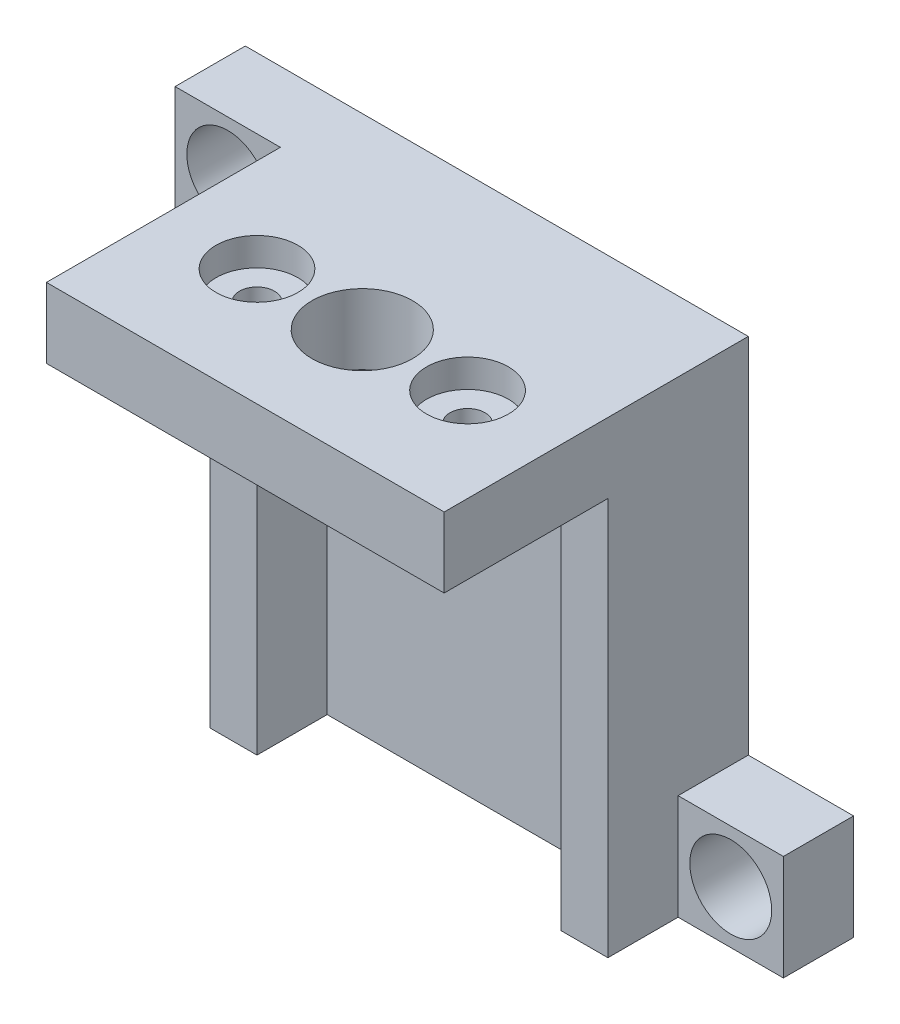
ISO-10303-21;
HEADER;
FILE_DESCRIPTION(('STEP AP214'),'2;1');
FILE_NAME('part.step','',(''),(''),'','','');
FILE_SCHEMA(('AUTOMOTIVE_DESIGN { 1 0 10303 214 1 1 1 1 }'));
ENDSEC;
DATA;
#1=APPLICATION_CONTEXT('core data for automotive mechanical design processes');
#2=APPLICATION_PROTOCOL_DEFINITION('international standard','automotive_design',2000,#1);
#3=PRODUCT_CONTEXT('',#1,'mechanical');
#4=PRODUCT('Part','Part','',(#3));
#5=PRODUCT_RELATED_PRODUCT_CATEGORY('part','',(#4));
#6=PRODUCT_DEFINITION_FORMATION('','',#4);
#7=PRODUCT_DEFINITION_CONTEXT('part definition',#1,'design');
#8=PRODUCT_DEFINITION('design','',#6,#7);
#9=PRODUCT_DEFINITION_SHAPE('','',#8);
#10=(LENGTH_UNIT() NAMED_UNIT(*) SI_UNIT(.MILLI.,.METRE.));
#11=(NAMED_UNIT(*) PLANE_ANGLE_UNIT() SI_UNIT($,.RADIAN.));
#12=(NAMED_UNIT(*) SI_UNIT($,.STERADIAN.) SOLID_ANGLE_UNIT());
#13=UNCERTAINTY_MEASURE_WITH_UNIT(LENGTH_MEASURE(1.E-05),#10,'distance_accuracy_value','');
#14=(GEOMETRIC_REPRESENTATION_CONTEXT(3) GLOBAL_UNCERTAINTY_ASSIGNED_CONTEXT((#13)) GLOBAL_UNIT_ASSIGNED_CONTEXT((#10,
#11,#12)) REPRESENTATION_CONTEXT('',''));
#15=CARTESIAN_POINT('',(0.,0.,0.));
#16=DIRECTION('',(0.,0.,1.));
#17=DIRECTION('',(1.,0.,0.));
#18=AXIS2_PLACEMENT_3D('',#15,#16,#17);
#19=CARTESIAN_POINT('',(0.,0.,6.));
#20=DIRECTION('',(0.,0.,-1.));
#21=DIRECTION('',(-1.,0.,0.));
#22=AXIS2_PLACEMENT_3D('',#19,#20,#21);
#23=PLANE('',#22);
#24=DIRECTION('',(1.,0.,0.));
#25=VECTOR('',#24,1.);
#26=CARTESIAN_POINT('',(0.,17.,6.));
#27=LINE('',#26,#25);
#28=CARTESIAN_POINT('',(0.,17.,6.));
#29=VERTEX_POINT('',#28);
#30=CARTESIAN_POINT('',(2.,17.,6.));
#31=VERTEX_POINT('',#30);
#32=EDGE_CURVE('E11',#29,#31,#27,.T.);
#33=ORIENTED_EDGE('',*,*,#32,.F.);
#34=DIRECTION('',(0.,1.,0.));
#35=VECTOR('',#34,1.);
#36=CARTESIAN_POINT('',(0.,0.,6.));
#37=LINE('',#36,#35);
#38=CARTESIAN_POINT('',(0.,0.,6.));
#39=VERTEX_POINT('',#38);
#40=EDGE_CURVE('E160',#39,#29,#37,.T.);
#41=ORIENTED_EDGE('',*,*,#40,.F.);
#42=DIRECTION('',(-1.,0.,0.));
#43=VECTOR('',#42,1.);
#44=CARTESIAN_POINT('',(2.,0.,6.));
#45=LINE('',#44,#43);
#46=CARTESIAN_POINT('',(2.,0.,6.));
#47=VERTEX_POINT('',#46);
#48=EDGE_CURVE('E192',#47,#39,#45,.T.);
#49=ORIENTED_EDGE('',*,*,#48,.F.);
#50=DIRECTION('',(0.,-1.,0.));
#51=VECTOR('',#50,1.);
#52=CARTESIAN_POINT('',(2.,17.,6.));
#53=LINE('',#52,#51);
#54=EDGE_CURVE('E209',#31,#47,#53,.T.);
#55=ORIENTED_EDGE('',*,*,#54,.F.);
#56=EDGE_LOOP('',(#33,#41,#49,#55));
#57=FACE_BOUND('',#56,.T.);
#58=ADVANCED_FACE('F39',(#57),#23,.F.);
#59=CARTESIAN_POINT('',(15.,17.,6.));
#60=VERTEX_POINT('',#59);
#61=CARTESIAN_POINT('',(17.,17.,6.));
#62=VERTEX_POINT('',#61);
#63=EDGE_CURVE('E49',#60,#62,#27,.T.);
#64=ORIENTED_EDGE('',*,*,#63,.F.);
#65=DIRECTION('',(0.,1.,0.));
#66=VECTOR('',#65,1.);
#67=CARTESIAN_POINT('',(15.,0.,6.));
#68=LINE('',#67,#66);
#69=CARTESIAN_POINT('',(15.,0.,6.));
#70=VERTEX_POINT('',#69);
#71=EDGE_CURVE('E205',#70,#60,#68,.T.);
#72=ORIENTED_EDGE('',*,*,#71,.F.);
#73=DIRECTION('',(-1.,0.,0.));
#74=VECTOR('',#73,1.);
#75=CARTESIAN_POINT('',(17.,0.,6.));
#76=LINE('',#75,#74);
#77=CARTESIAN_POINT('',(17.,0.,6.));
#78=VERTEX_POINT('',#77);
#79=EDGE_CURVE('E201',#78,#70,#76,.T.);
#80=ORIENTED_EDGE('',*,*,#79,.F.);
#81=DIRECTION('',(0.,-1.,0.));
#82=VECTOR('',#81,1.);
#83=CARTESIAN_POINT('',(17.,20.,6.));
#84=LINE('',#83,#82);
#85=EDGE_CURVE('E63',#62,#78,#84,.T.);
#86=ORIENTED_EDGE('',*,*,#85,.F.);
#87=EDGE_LOOP('',(#64,#72,#80,#86));
#88=FACE_BOUND('',#87,.T.);
#89=ADVANCED_FACE('F404',(#88),#23,.F.);
#90=CARTESIAN_POINT('',(0.,0.,3.));
#91=DIRECTION('',(0.,0.,1.));
#92=DIRECTION('',(1.,0.,0.));
#93=AXIS2_PLACEMENT_3D('',#90,#91,#92);
#94=PLANE('',#93);
#95=CARTESIAN_POINT('',(-2.25,17.75,3.));
#96=DIRECTION('',(0.,0.,1.));
#97=DIRECTION('',(1.,0.,0.));
#98=AXIS2_PLACEMENT_3D('',#95,#96,#97);
#99=CIRCLE('',#98,1.75);
#100=CARTESIAN_POINT('',(-0.5,17.75,3.));
#101=VERTEX_POINT('',#100);
#102=EDGE_CURVE('E335',#101,#101,#99,.T.);
#103=ORIENTED_EDGE('',*,*,#102,.F.);
#104=EDGE_LOOP('',(#103));
#105=FACE_BOUND('',#104,.T.);
#106=DIRECTION('',(1.,0.,0.));
#107=VECTOR('',#106,1.);
#108=CARTESIAN_POINT('',(0.,15.5,3.));
#109=LINE('',#108,#107);
#110=CARTESIAN_POINT('',(-4.5,15.5,3.));
#111=VERTEX_POINT('',#110);
#112=CARTESIAN_POINT('',(0.,15.5,3.));
#113=VERTEX_POINT('',#112);
#114=EDGE_CURVE('E268',#111,#113,#109,.T.);
#115=ORIENTED_EDGE('',*,*,#114,.T.);
#116=DIRECTION('',(0.,1.,0.));
#117=VECTOR('',#116,1.);
#118=CARTESIAN_POINT('',(0.,15.5,3.));
#119=LINE('',#118,#117);
#120=CARTESIAN_POINT('',(0.,20.,3.));
#121=VERTEX_POINT('',#120);
#122=EDGE_CURVE('E214',#113,#121,#119,.T.);
#123=ORIENTED_EDGE('',*,*,#122,.T.);
#124=DIRECTION('',(-1.,0.,0.));
#125=VECTOR('',#124,1.);
#126=CARTESIAN_POINT('',(0.,20.,3.));
#127=LINE('',#126,#125);
#128=CARTESIAN_POINT('',(-4.5,20.,3.));
#129=VERTEX_POINT('',#128);
#130=EDGE_CURVE('E262',#121,#129,#127,.T.);
#131=ORIENTED_EDGE('',*,*,#130,.T.);
#132=DIRECTION('',(0.,-1.,0.));
#133=VECTOR('',#132,1.);
#134=CARTESIAN_POINT('',(-4.5,20.,3.));
#135=LINE('',#134,#133);
#136=EDGE_CURVE('E265',#129,#111,#135,.T.);
#137=ORIENTED_EDGE('',*,*,#136,.T.);
#138=EDGE_LOOP('',(#115,#123,#131,#137));
#139=FACE_BOUND('',#138,.T.);
#140=ADVANCED_FACE('F409',(#105,#139),#94,.T.);
#141=CARTESIAN_POINT('',(19.25,2.25,3.));
#142=DIRECTION('',(0.,0.,1.));
#143=DIRECTION('',(1.,0.,0.));
#144=AXIS2_PLACEMENT_3D('',#141,#142,#143);
#145=CIRCLE('',#144,1.75);
#146=CARTESIAN_POINT('',(21.,2.25,3.));
#147=VERTEX_POINT('',#146);
#148=EDGE_CURVE('E353',#147,#147,#145,.T.);
#149=ORIENTED_EDGE('',*,*,#148,.F.);
#150=EDGE_LOOP('',(#149));
#151=FACE_BOUND('',#150,.T.);
#152=DIRECTION('',(-1.,0.,0.));
#153=VECTOR('',#152,1.);
#154=CARTESIAN_POINT('',(17.,4.5,3.));
#155=LINE('',#154,#153);
#156=CARTESIAN_POINT('',(21.5,4.5,3.));
#157=VERTEX_POINT('',#156);
#158=CARTESIAN_POINT('',(17.,4.5,3.));
#159=VERTEX_POINT('',#158);
#160=EDGE_CURVE('E258',#157,#159,#155,.T.);
#161=ORIENTED_EDGE('',*,*,#160,.T.);
#162=DIRECTION('',(0.,-1.,0.));
#163=VECTOR('',#162,1.);
#164=CARTESIAN_POINT('',(17.,20.,3.));
#165=LINE('',#164,#163);
#166=CARTESIAN_POINT('',(17.,0.,3.));
#167=VERTEX_POINT('',#166);
#168=EDGE_CURVE('E217',#159,#167,#165,.T.);
#169=ORIENTED_EDGE('',*,*,#168,.T.);
#170=DIRECTION('',(1.,0.,0.));
#171=VECTOR('',#170,1.);
#172=CARTESIAN_POINT('',(0.,0.,3.));
#173=LINE('',#172,#171);
#174=CARTESIAN_POINT('',(21.5,0.,3.));
#175=VERTEX_POINT('',#174);
#176=EDGE_CURVE('E250',#167,#175,#173,.T.);
#177=ORIENTED_EDGE('',*,*,#176,.T.);
#178=DIRECTION('',(0.,1.,0.));
#179=VECTOR('',#178,1.);
#180=CARTESIAN_POINT('',(21.5,0.,3.));
#181=LINE('',#180,#179);
#182=EDGE_CURVE('E255',#175,#157,#181,.T.);
#183=ORIENTED_EDGE('',*,*,#182,.T.);
#184=EDGE_LOOP('',(#161,#169,#177,#183));
#185=FACE_BOUND('',#184,.T.);
#186=ADVANCED_FACE('F427',(#151,#185),#94,.T.);
#187=CARTESIAN_POINT('',(2.,0.,3.));
#188=VERTEX_POINT('',#187);
#189=CARTESIAN_POINT('',(15.,0.,3.));
#190=VERTEX_POINT('',#189);
#191=EDGE_CURVE('E253',#188,#190,#173,.T.);
#192=ORIENTED_EDGE('',*,*,#191,.T.);
#193=DIRECTION('',(0.,1.,0.));
#194=VECTOR('',#193,1.);
#195=CARTESIAN_POINT('',(15.,0.,3.));
#196=LINE('',#195,#194);
#197=CARTESIAN_POINT('',(15.,17.,3.));
#198=VERTEX_POINT('',#197);
#199=EDGE_CURVE('E190',#190,#198,#196,.T.);
#200=ORIENTED_EDGE('',*,*,#199,.T.);
#201=DIRECTION('',(-1.,0.,0.));
#202=VECTOR('',#201,1.);
#203=CARTESIAN_POINT('',(15.,17.,3.));
#204=LINE('',#203,#202);
#205=CARTESIAN_POINT('',(2.,17.,3.));
#206=VERTEX_POINT('',#205);
#207=EDGE_CURVE('E225',#198,#206,#204,.T.);
#208=ORIENTED_EDGE('',*,*,#207,.T.);
#209=DIRECTION('',(0.,-1.,0.));
#210=VECTOR('',#209,1.);
#211=CARTESIAN_POINT('',(2.,17.,3.));
#212=LINE('',#211,#210);
#213=EDGE_CURVE('E196',#206,#188,#212,.T.);
#214=ORIENTED_EDGE('',*,*,#213,.T.);
#215=EDGE_LOOP('',(#192,#200,#208,#214));
#216=FACE_BOUND('',#215,.T.);
#217=ADVANCED_FACE('F429',(#216),#94,.T.);
#218=CARTESIAN_POINT('',(0.,0.,3.));
#219=DIRECTION('',(1.,0.,0.));
#220=DIRECTION('',(0.,1.,0.));
#221=AXIS2_PLACEMENT_3D('',#218,#219,#220);
#222=PLANE('',#221);
#223=DIRECTION('',(0.,0.,-1.));
#224=VECTOR('',#223,1.);
#225=CARTESIAN_POINT('',(0.,20.,6.));
#226=LINE('',#225,#224);
#227=CARTESIAN_POINT('',(0.,20.,13.));
#228=VERTEX_POINT('',#227);
#229=EDGE_CURVE('E213',#228,#121,#226,.T.);
#230=ORIENTED_EDGE('',*,*,#229,.T.);
#231=ORIENTED_EDGE('',*,*,#122,.F.);
#232=DIRECTION('',(0.,0.,-1.));
#233=VECTOR('',#232,1.);
#234=CARTESIAN_POINT('',(0.,15.5,3.));
#235=LINE('',#234,#233);
#236=CARTESIAN_POINT('',(0.,15.5,0.));
#237=VERTEX_POINT('',#236);
#238=EDGE_CURVE('E272',#113,#237,#235,.T.);
#239=ORIENTED_EDGE('',*,*,#238,.T.);
#240=DIRECTION('',(0.,-1.,0.));
#241=VECTOR('',#240,1.);
#242=CARTESIAN_POINT('',(0.,0.,0.));
#243=LINE('',#242,#241);
#244=CARTESIAN_POINT('',(0.,0.,0.));
#245=VERTEX_POINT('',#244);
#246=EDGE_CURVE('E235',#237,#245,#243,.T.);
#247=ORIENTED_EDGE('',*,*,#246,.T.);
#248=DIRECTION('',(0.,0.,-1.));
#249=VECTOR('',#248,1.);
#250=CARTESIAN_POINT('',(0.,0.,3.));
#251=LINE('',#250,#249);
#252=EDGE_CURVE('E221',#39,#245,#251,.T.);
#253=ORIENTED_EDGE('',*,*,#252,.F.);
#254=ORIENTED_EDGE('',*,*,#40,.T.);
#255=DIRECTION('',(0.,0.,1.));
#256=VECTOR('',#255,1.);
#257=CARTESIAN_POINT('',(0.,17.,0.));
#258=LINE('',#257,#256);
#259=CARTESIAN_POINT('',(0.,17.,13.));
#260=VERTEX_POINT('',#259);
#261=EDGE_CURVE('E155',#29,#260,#258,.T.);
#262=ORIENTED_EDGE('',*,*,#261,.T.);
#263=DIRECTION('',(0.,1.,0.));
#264=VECTOR('',#263,1.);
#265=CARTESIAN_POINT('',(0.,17.,13.));
#266=LINE('',#265,#264);
#267=EDGE_CURVE('E158',#260,#228,#266,.T.);
#268=ORIENTED_EDGE('',*,*,#267,.T.);
#269=EDGE_LOOP('',(#230,#231,#239,#247,#253,#254,#262,#268));
#270=FACE_BOUND('',#269,.T.);
#271=ADVANCED_FACE('F41',(#270),#222,.F.);
#272=CARTESIAN_POINT('',(17.,0.,3.));
#273=DIRECTION('',(0.,1.,0.));
#274=DIRECTION('',(0.,0.,1.));
#275=AXIS2_PLACEMENT_3D('',#272,#273,#274);
#276=PLANE('',#275);
#277=DIRECTION('',(1.,0.,0.));
#278=VECTOR('',#277,1.);
#279=CARTESIAN_POINT('',(17.,0.,0.));
#280=LINE('',#279,#278);
#281=CARTESIAN_POINT('',(21.5,0.,0.));
#282=VERTEX_POINT('',#281);
#283=EDGE_CURVE('E276',#245,#282,#280,.T.);
#284=ORIENTED_EDGE('',*,*,#283,.T.);
#285=DIRECTION('',(0.,0.,-1.));
#286=VECTOR('',#285,1.);
#287=CARTESIAN_POINT('',(21.5,0.,3.));
#288=LINE('',#287,#286);
#289=EDGE_CURVE('E319',#175,#282,#288,.T.);
#290=ORIENTED_EDGE('',*,*,#289,.F.);
#291=ORIENTED_EDGE('',*,*,#176,.F.);
#292=DIRECTION('',(0.,0.,-1.));
#293=VECTOR('',#292,1.);
#294=CARTESIAN_POINT('',(17.,0.,6.));
#295=LINE('',#294,#293);
#296=EDGE_CURVE('E245',#78,#167,#295,.T.);
#297=ORIENTED_EDGE('',*,*,#296,.F.);
#298=ORIENTED_EDGE('',*,*,#79,.T.);
#299=DIRECTION('',(0.,0.,-1.));
#300=VECTOR('',#299,1.);
#301=CARTESIAN_POINT('',(15.,0.,6.));
#302=LINE('',#301,#300);
#303=EDGE_CURVE('E242',#70,#190,#302,.T.);
#304=ORIENTED_EDGE('',*,*,#303,.T.);
#305=ORIENTED_EDGE('',*,*,#191,.F.);
#306=DIRECTION('',(0.,0.,-1.));
#307=VECTOR('',#306,1.);
#308=CARTESIAN_POINT('',(2.,0.,6.));
#309=LINE('',#308,#307);
#310=EDGE_CURVE('E232',#47,#188,#309,.T.);
#311=ORIENTED_EDGE('',*,*,#310,.F.);
#312=ORIENTED_EDGE('',*,*,#48,.T.);
#313=ORIENTED_EDGE('',*,*,#252,.T.);
#314=EDGE_LOOP('',(#284,#290,#291,#297,#298,#304,#305,#311,#312,#313));
#315=FACE_BOUND('',#314,.T.);
#316=ADVANCED_FACE('F448',(#315),#276,.F.);
#317=CARTESIAN_POINT('',(21.5,0.,3.));
#318=DIRECTION('',(-1.,0.,0.));
#319=DIRECTION('',(0.,-1.,0.));
#320=AXIS2_PLACEMENT_3D('',#317,#318,#319);
#321=PLANE('',#320);
#322=DIRECTION('',(0.,1.,0.));
#323=VECTOR('',#322,1.);
#324=CARTESIAN_POINT('',(21.5,0.,0.));
#325=LINE('',#324,#323);
#326=CARTESIAN_POINT('',(21.5,4.5,0.));
#327=VERTEX_POINT('',#326);
#328=EDGE_CURVE('E279',#282,#327,#325,.T.);
#329=ORIENTED_EDGE('',*,*,#328,.T.);
#330=DIRECTION('',(0.,0.,-1.));
#331=VECTOR('',#330,1.);
#332=CARTESIAN_POINT('',(21.5,4.5,3.));
#333=LINE('',#332,#331);
#334=EDGE_CURVE('E315',#157,#327,#333,.T.);
#335=ORIENTED_EDGE('',*,*,#334,.F.);
#336=ORIENTED_EDGE('',*,*,#182,.F.);
#337=ORIENTED_EDGE('',*,*,#289,.T.);
#338=EDGE_LOOP('',(#329,#335,#336,#337));
#339=FACE_BOUND('',#338,.T.);
#340=ADVANCED_FACE('F474',(#339),#321,.F.);
#341=CARTESIAN_POINT('',(17.,4.5,3.));
#342=DIRECTION('',(0.,-1.,0.));
#343=DIRECTION('',(0.,0.,-1.));
#344=AXIS2_PLACEMENT_3D('',#341,#342,#343);
#345=PLANE('',#344);
#346=DIRECTION('',(-1.,0.,0.));
#347=VECTOR('',#346,1.);
#348=CARTESIAN_POINT('',(17.,4.5,0.));
#349=LINE('',#348,#347);
#350=CARTESIAN_POINT('',(17.,4.5,0.));
#351=VERTEX_POINT('',#350);
#352=EDGE_CURVE('E282',#327,#351,#349,.T.);
#353=ORIENTED_EDGE('',*,*,#352,.T.);
#354=DIRECTION('',(0.,0.,-1.));
#355=VECTOR('',#354,1.);
#356=CARTESIAN_POINT('',(17.,4.5,3.));
#357=LINE('',#356,#355);
#358=EDGE_CURVE('E311',#159,#351,#357,.T.);
#359=ORIENTED_EDGE('',*,*,#358,.F.);
#360=ORIENTED_EDGE('',*,*,#160,.F.);
#361=ORIENTED_EDGE('',*,*,#334,.T.);
#362=EDGE_LOOP('',(#353,#359,#360,#361));
#363=FACE_BOUND('',#362,.T.);
#364=ADVANCED_FACE('F399',(#363),#345,.F.);
#365=CARTESIAN_POINT('',(17.,4.5,3.));
#366=DIRECTION('',(-1.,0.,0.));
#367=DIRECTION('',(0.,-1.,0.));
#368=AXIS2_PLACEMENT_3D('',#365,#366,#367);
#369=PLANE('',#368);
#370=DIRECTION('',(0.,0.,-1.));
#371=VECTOR('',#370,1.);
#372=CARTESIAN_POINT('',(17.,20.,3.));
#373=LINE('',#372,#371);
#374=CARTESIAN_POINT('',(17.,20.,13.));
#375=VERTEX_POINT('',#374);
#376=CARTESIAN_POINT('',(17.,20.,0.));
#377=VERTEX_POINT('',#376);
#378=EDGE_CURVE('E307',#375,#377,#373,.T.);
#379=ORIENTED_EDGE('',*,*,#378,.F.);
#380=DIRECTION('',(0.,1.,0.));
#381=VECTOR('',#380,1.);
#382=CARTESIAN_POINT('',(17.,17.,13.));
#383=LINE('',#382,#381);
#384=CARTESIAN_POINT('',(17.,17.,13.));
#385=VERTEX_POINT('',#384);
#386=EDGE_CURVE('E173',#385,#375,#383,.T.);
#387=ORIENTED_EDGE('',*,*,#386,.F.);
#388=DIRECTION('',(0.,0.,-1.));
#389=VECTOR('',#388,1.);
#390=CARTESIAN_POINT('',(17.,17.,0.));
#391=LINE('',#390,#389);
#392=EDGE_CURVE('E174',#385,#62,#391,.T.);
#393=ORIENTED_EDGE('',*,*,#392,.T.);
#394=ORIENTED_EDGE('',*,*,#85,.T.);
#395=ORIENTED_EDGE('',*,*,#296,.T.);
#396=ORIENTED_EDGE('',*,*,#168,.F.);
#397=ORIENTED_EDGE('',*,*,#358,.T.);
#398=DIRECTION('',(0.,1.,0.));
#399=VECTOR('',#398,1.);
#400=CARTESIAN_POINT('',(17.,4.5,0.));
#401=LINE('',#400,#399);
#402=EDGE_CURVE('E285',#351,#377,#401,.T.);
#403=ORIENTED_EDGE('',*,*,#402,.T.);
#404=EDGE_LOOP('',(#379,#387,#393,#394,#395,#396,#397,#403));
#405=FACE_BOUND('',#404,.T.);
#406=ADVANCED_FACE('F389',(#405),#369,.F.);
#407=CARTESIAN_POINT('',(0.,20.,3.));
#408=DIRECTION('',(0.,-1.,0.));
#409=DIRECTION('',(0.,0.,-1.));
#410=AXIS2_PLACEMENT_3D('',#407,#408,#409);
#411=PLANE('',#410);
#412=CARTESIAN_POINT('',(4.,20.,8.));
#413=DIRECTION('',(0.,-1.,0.));
#414=DIRECTION('',(0.,0.,-1.));
#415=AXIS2_PLACEMENT_3D('',#412,#413,#414);
#416=CIRCLE('',#415,1.75);
#417=CARTESIAN_POINT('',(4.,20.,6.25));
#418=VERTEX_POINT('',#417);
#419=EDGE_CURVE('E337',#418,#418,#416,.T.);
#420=ORIENTED_EDGE('',*,*,#419,.T.);
#421=EDGE_LOOP('',(#420));
#422=FACE_BOUND('',#421,.T.);
#423=CARTESIAN_POINT('',(13.,20.,8.));
#424=DIRECTION('',(0.,-1.,0.));
#425=DIRECTION('',(0.,0.,-1.));
#426=AXIS2_PLACEMENT_3D('',#423,#424,#425);
#427=CIRCLE('',#426,1.75);
#428=CARTESIAN_POINT('',(13.,20.,6.25));
#429=VERTEX_POINT('',#428);
#430=EDGE_CURVE('E349',#429,#429,#427,.T.);
#431=ORIENTED_EDGE('',*,*,#430,.T.);
#432=EDGE_LOOP('',(#431));
#433=FACE_BOUND('',#432,.T.);
#434=ORIENTED_EDGE('',*,*,#130,.F.);
#435=ORIENTED_EDGE('',*,*,#229,.F.);
#436=DIRECTION('',(1.,0.,0.));
#437=VECTOR('',#436,1.);
#438=CARTESIAN_POINT('',(0.,20.,13.));
#439=LINE('',#438,#437);
#440=EDGE_CURVE('E165',#228,#375,#439,.T.);
#441=ORIENTED_EDGE('',*,*,#440,.T.);
#442=ORIENTED_EDGE('',*,*,#378,.T.);
#443=DIRECTION('',(-1.,0.,0.));
#444=VECTOR('',#443,1.);
#445=CARTESIAN_POINT('',(0.,20.,0.));
#446=LINE('',#445,#444);
#447=CARTESIAN_POINT('',(-4.5,20.,0.));
#448=VERTEX_POINT('',#447);
#449=EDGE_CURVE('E288',#377,#448,#446,.T.);
#450=ORIENTED_EDGE('',*,*,#449,.T.);
#451=DIRECTION('',(0.,0.,-1.));
#452=VECTOR('',#451,1.);
#453=CARTESIAN_POINT('',(-4.5,20.,3.));
#454=LINE('',#453,#452);
#455=EDGE_CURVE('E303',#129,#448,#454,.T.);
#456=ORIENTED_EDGE('',*,*,#455,.F.);
#457=EDGE_LOOP('',(#434,#435,#441,#442,#450,#456));
#458=FACE_BOUND('',#457,.T.);
#459=CARTESIAN_POINT('',(8.5,20.,8.));
#460=DIRECTION('',(0.,1.,0.));
#461=DIRECTION('',(0.,0.,1.));
#462=AXIS2_PLACEMENT_3D('',#459,#460,#461);
#463=CIRCLE('',#462,2.15);
#464=CARTESIAN_POINT('',(8.5,20.,10.15));
#465=VERTEX_POINT('',#464);
#466=EDGE_CURVE('E376',#465,#465,#463,.T.);
#467=ORIENTED_EDGE('',*,*,#466,.F.);
#468=EDGE_LOOP('',(#467));
#469=FACE_BOUND('',#468,.T.);
#470=ADVANCED_FACE('F386',(#422,#433,#458,#469),#411,.F.);
#471=CARTESIAN_POINT('',(-4.5,20.,3.));
#472=DIRECTION('',(1.,0.,0.));
#473=DIRECTION('',(0.,0.,-1.));
#474=AXIS2_PLACEMENT_3D('',#471,#472,#473);
#475=PLANE('',#474);
#476=DIRECTION('',(0.,-1.,0.));
#477=VECTOR('',#476,1.);
#478=CARTESIAN_POINT('',(-4.5,20.,0.));
#479=LINE('',#478,#477);
#480=CARTESIAN_POINT('',(-4.5,15.5,0.));
#481=VERTEX_POINT('',#480);
#482=EDGE_CURVE('E291',#448,#481,#479,.T.);
#483=ORIENTED_EDGE('',*,*,#482,.T.);
#484=DIRECTION('',(0.,0.,-1.));
#485=VECTOR('',#484,1.);
#486=CARTESIAN_POINT('',(-4.5,15.5,3.));
#487=LINE('',#486,#485);
#488=EDGE_CURVE('E299',#111,#481,#487,.T.);
#489=ORIENTED_EDGE('',*,*,#488,.F.);
#490=ORIENTED_EDGE('',*,*,#136,.F.);
#491=ORIENTED_EDGE('',*,*,#455,.T.);
#492=EDGE_LOOP('',(#483,#489,#490,#491));
#493=FACE_BOUND('',#492,.T.);
#494=ADVANCED_FACE('F388',(#493),#475,.F.);
#495=CARTESIAN_POINT('',(0.,15.5,3.));
#496=DIRECTION('',(0.,1.,0.));
#497=DIRECTION('',(0.,0.,1.));
#498=AXIS2_PLACEMENT_3D('',#495,#496,#497);
#499=PLANE('',#498);
#500=DIRECTION('',(1.,0.,0.));
#501=VECTOR('',#500,1.);
#502=CARTESIAN_POINT('',(0.,15.5,0.));
#503=LINE('',#502,#501);
#504=EDGE_CURVE('E254',#481,#237,#503,.T.);
#505=ORIENTED_EDGE('',*,*,#504,.T.);
#506=ORIENTED_EDGE('',*,*,#238,.F.);
#507=ORIENTED_EDGE('',*,*,#114,.F.);
#508=ORIENTED_EDGE('',*,*,#488,.T.);
#509=EDGE_LOOP('',(#505,#506,#507,#508));
#510=FACE_BOUND('',#509,.T.);
#511=ADVANCED_FACE('F396',(#510),#499,.F.);
#512=CARTESIAN_POINT('',(0.,0.,0.));
#513=DIRECTION('',(0.,0.,1.));
#514=DIRECTION('',(1.,0.,0.));
#515=AXIS2_PLACEMENT_3D('',#512,#513,#514);
#516=PLANE('',#515);
#517=CARTESIAN_POINT('',(19.25,2.25,0.));
#518=DIRECTION('',(0.,0.,1.));
#519=DIRECTION('',(1.,0.,0.));
#520=AXIS2_PLACEMENT_3D('',#517,#518,#519);
#521=CIRCLE('',#520,1.75);
#522=CARTESIAN_POINT('',(21.,2.25,0.));
#523=VERTEX_POINT('',#522);
#524=EDGE_CURVE('E357',#523,#523,#521,.F.);
#525=ORIENTED_EDGE('',*,*,#524,.F.);
#526=EDGE_LOOP('',(#525));
#527=FACE_BOUND('',#526,.T.);
#528=CARTESIAN_POINT('',(-2.25,17.75,0.));
#529=DIRECTION('',(0.,0.,1.));
#530=DIRECTION('',(1.,0.,0.));
#531=AXIS2_PLACEMENT_3D('',#528,#529,#530);
#532=CIRCLE('',#531,1.75);
#533=CARTESIAN_POINT('',(-0.5,17.75,0.));
#534=VERTEX_POINT('',#533);
#535=EDGE_CURVE('E358',#534,#534,#532,.F.);
#536=ORIENTED_EDGE('',*,*,#535,.F.);
#537=EDGE_LOOP('',(#536));
#538=FACE_BOUND('',#537,.T.);
#539=ORIENTED_EDGE('',*,*,#482,.F.);
#540=ORIENTED_EDGE('',*,*,#449,.F.);
#541=ORIENTED_EDGE('',*,*,#402,.F.);
#542=ORIENTED_EDGE('',*,*,#352,.F.);
#543=ORIENTED_EDGE('',*,*,#328,.F.);
#544=ORIENTED_EDGE('',*,*,#283,.F.);
#545=ORIENTED_EDGE('',*,*,#246,.F.);
#546=ORIENTED_EDGE('',*,*,#504,.F.);
#547=EDGE_LOOP('',(#539,#540,#541,#542,#543,#544,#545,#546));
#548=FACE_BOUND('',#547,.T.);
#549=ADVANCED_FACE('F416',(#527,#538,#548),#516,.F.);
#550=CARTESIAN_POINT('',(2.,17.,6.));
#551=DIRECTION('',(1.,0.,0.));
#552=DIRECTION('',(0.,1.,0.));
#553=AXIS2_PLACEMENT_3D('',#550,#551,#552);
#554=PLANE('',#553);
#555=ORIENTED_EDGE('',*,*,#213,.F.);
#556=DIRECTION('',(0.,0.,-1.));
#557=VECTOR('',#556,1.);
#558=CARTESIAN_POINT('',(2.,17.,6.));
#559=LINE('',#558,#557);
#560=EDGE_CURVE('E236',#31,#206,#559,.T.);
#561=ORIENTED_EDGE('',*,*,#560,.F.);
#562=ORIENTED_EDGE('',*,*,#54,.T.);
#563=ORIENTED_EDGE('',*,*,#310,.T.);
#564=EDGE_LOOP('',(#555,#561,#562,#563));
#565=FACE_BOUND('',#564,.T.);
#566=ADVANCED_FACE('F413',(#565),#554,.T.);
#567=CARTESIAN_POINT('',(15.,17.,6.));
#568=DIRECTION('',(0.,-1.,0.));
#569=DIRECTION('',(0.,0.,-1.));
#570=AXIS2_PLACEMENT_3D('',#567,#568,#569);
#571=PLANE('',#570);
#572=CARTESIAN_POINT('',(8.5,17.,8.));
#573=DIRECTION('',(0.,1.,0.));
#574=DIRECTION('',(0.,0.,1.));
#575=AXIS2_PLACEMENT_3D('',#572,#573,#574);
#576=CIRCLE('',#575,2.15);
#577=CARTESIAN_POINT('',(8.5,17.,10.15));
#578=VERTEX_POINT('',#577);
#579=EDGE_CURVE('E188',#578,#578,#576,.T.);
#580=ORIENTED_EDGE('',*,*,#579,.T.);
#581=EDGE_LOOP('',(#580));
#582=FACE_BOUND('',#581,.T.);
#583=ORIENTED_EDGE('',*,*,#32,.T.);
#584=ORIENTED_EDGE('',*,*,#560,.T.);
#585=ORIENTED_EDGE('',*,*,#207,.F.);
#586=DIRECTION('',(0.,0.,-1.));
#587=VECTOR('',#586,1.);
#588=CARTESIAN_POINT('',(15.,17.,6.));
#589=LINE('',#588,#587);
#590=EDGE_CURVE('E239',#60,#198,#589,.T.);
#591=ORIENTED_EDGE('',*,*,#590,.F.);
#592=ORIENTED_EDGE('',*,*,#63,.T.);
#593=ORIENTED_EDGE('',*,*,#392,.F.);
#594=DIRECTION('',(1.,0.,0.));
#595=VECTOR('',#594,1.);
#596=CARTESIAN_POINT('',(0.,17.,13.));
#597=LINE('',#596,#595);
#598=EDGE_CURVE('E164',#260,#385,#597,.T.);
#599=ORIENTED_EDGE('',*,*,#598,.F.);
#600=ORIENTED_EDGE('',*,*,#261,.F.);
#601=EDGE_LOOP('',(#583,#584,#585,#591,#592,#593,#599,#600));
#602=FACE_BOUND('',#601,.T.);
#603=CARTESIAN_POINT('',(4.,17.,8.));
#604=DIRECTION('',(0.,1.,0.));
#605=DIRECTION('',(0.,0.,1.));
#606=AXIS2_PLACEMENT_3D('',#603,#604,#605);
#607=CIRCLE('',#606,0.749999999999999);
#608=CARTESIAN_POINT('',(4.,17.,8.75));
#609=VERTEX_POINT('',#608);
#610=EDGE_CURVE('E362',#609,#609,#607,.T.);
#611=ORIENTED_EDGE('',*,*,#610,.T.);
#612=EDGE_LOOP('',(#611));
#613=FACE_BOUND('',#612,.T.);
#614=CARTESIAN_POINT('',(13.,17.,8.));
#615=DIRECTION('',(0.,1.,0.));
#616=DIRECTION('',(0.,0.,1.));
#617=AXIS2_PLACEMENT_3D('',#614,#615,#616);
#618=CIRCLE('',#617,0.75);
#619=CARTESIAN_POINT('',(13.,17.,8.75));
#620=VERTEX_POINT('',#619);
#621=EDGE_CURVE('E372',#620,#620,#618,.T.);
#622=ORIENTED_EDGE('',*,*,#621,.T.);
#623=EDGE_LOOP('',(#622));
#624=FACE_BOUND('',#623,.T.);
#625=ADVANCED_FACE('F177',(#582,#602,#613,#624),#571,.T.);
#626=CARTESIAN_POINT('',(15.,0.,6.));
#627=DIRECTION('',(-1.,0.,0.));
#628=DIRECTION('',(0.,0.,1.));
#629=AXIS2_PLACEMENT_3D('',#626,#627,#628);
#630=PLANE('',#629);
#631=ORIENTED_EDGE('',*,*,#199,.F.);
#632=ORIENTED_EDGE('',*,*,#303,.F.);
#633=ORIENTED_EDGE('',*,*,#71,.T.);
#634=ORIENTED_EDGE('',*,*,#590,.T.);
#635=EDGE_LOOP('',(#631,#632,#633,#634));
#636=FACE_BOUND('',#635,.T.);
#637=ADVANCED_FACE('F420',(#636),#630,.T.);
#638=CARTESIAN_POINT('',(8.5,17.,8.));
#639=DIRECTION('',(0.,1.,0.));
#640=DIRECTION('',(0.,0.,1.));
#641=AXIS2_PLACEMENT_3D('',#638,#639,#640);
#642=CYLINDRICAL_SURFACE('',#641,2.15);
#643=ORIENTED_EDGE('',*,*,#466,.T.);
#644=EDGE_LOOP('',(#643));
#645=FACE_BOUND('',#644,.T.);
#646=ORIENTED_EDGE('',*,*,#579,.F.);
#647=EDGE_LOOP('',(#646));
#648=FACE_BOUND('',#647,.T.);
#649=ADVANCED_FACE('F383',(#645,#648),#642,.F.);
#650=CARTESIAN_POINT('',(0.,17.,13.));
#651=DIRECTION('',(0.,0.,1.));
#652=DIRECTION('',(1.,0.,0.));
#653=AXIS2_PLACEMENT_3D('',#650,#651,#652);
#654=PLANE('',#653);
#655=ORIENTED_EDGE('',*,*,#440,.F.);
#656=ORIENTED_EDGE('',*,*,#267,.F.);
#657=ORIENTED_EDGE('',*,*,#598,.T.);
#658=ORIENTED_EDGE('',*,*,#386,.T.);
#659=EDGE_LOOP('',(#655,#656,#657,#658));
#660=FACE_BOUND('',#659,.T.);
#661=ADVANCED_FACE('F169',(#660),#654,.T.);
#662=CARTESIAN_POINT('',(13.,17.,8.));
#663=DIRECTION('',(0.,1.,0.));
#664=DIRECTION('',(0.,0.,1.));
#665=AXIS2_PLACEMENT_3D('',#662,#663,#664);
#666=CYLINDRICAL_SURFACE('',#665,0.75);
#667=CARTESIAN_POINT('',(13.,18.8,8.));
#668=DIRECTION('',(0.,-1.,0.));
#669=DIRECTION('',(0.,0.,-1.));
#670=AXIS2_PLACEMENT_3D('',#667,#668,#669);
#671=CIRCLE('',#670,0.75);
#672=CARTESIAN_POINT('',(13.,18.8,7.25));
#673=VERTEX_POINT('',#672);
#674=EDGE_CURVE('E43',#673,#673,#671,.F.);
#675=ORIENTED_EDGE('',*,*,#674,.T.);
#676=EDGE_LOOP('',(#675));
#677=FACE_BOUND('',#676,.T.);
#678=ORIENTED_EDGE('',*,*,#621,.F.);
#679=EDGE_LOOP('',(#678));
#680=FACE_BOUND('',#679,.T.);
#681=ADVANCED_FACE('F513',(#677,#680),#666,.F.);
#682=CARTESIAN_POINT('',(4.,17.,8.));
#683=DIRECTION('',(0.,1.,0.));
#684=DIRECTION('',(0.,0.,1.));
#685=AXIS2_PLACEMENT_3D('',#682,#683,#684);
#686=CYLINDRICAL_SURFACE('',#685,0.749999999999999);
#687=CARTESIAN_POINT('',(4.,18.8,8.));
#688=DIRECTION('',(0.,-1.,0.));
#689=DIRECTION('',(0.,0.,-1.));
#690=AXIS2_PLACEMENT_3D('',#687,#688,#689);
#691=CIRCLE('',#690,0.749999999999999);
#692=CARTESIAN_POINT('',(4.,18.8,7.25));
#693=VERTEX_POINT('',#692);
#694=EDGE_CURVE('E326',#693,#693,#691,.F.);
#695=ORIENTED_EDGE('',*,*,#694,.T.);
#696=EDGE_LOOP('',(#695));
#697=FACE_BOUND('',#696,.T.);
#698=ORIENTED_EDGE('',*,*,#610,.F.);
#699=EDGE_LOOP('',(#698));
#700=FACE_BOUND('',#699,.T.);
#701=ADVANCED_FACE('F507',(#697,#700),#686,.F.);
#702=CARTESIAN_POINT('',(-2.25,17.75,-0.00100000000000013));
#703=DIRECTION('',(0.,0.,1.));
#704=DIRECTION('',(1.,0.,0.));
#705=AXIS2_PLACEMENT_3D('',#702,#703,#704);
#706=CYLINDRICAL_SURFACE('',#705,1.75);
#707=CARTESIAN_POINT('',(-0.5,17.75,3.));
#708=CARTESIAN_POINT('',(-0.5,17.75,2.96875));
#709=CARTESIAN_POINT('',(-0.5,17.75,2.9375));
#710=CARTESIAN_POINT('',(-0.5,17.75,2.875));
#711=CARTESIAN_POINT('',(-0.5,17.75,2.84375));
#712=CARTESIAN_POINT('',(-0.5,17.75,2.78125));
#713=CARTESIAN_POINT('',(-0.5,17.75,2.75));
#714=CARTESIAN_POINT('',(-0.5,17.75,2.6875));
#715=CARTESIAN_POINT('',(-0.5,17.75,2.65625));
#716=CARTESIAN_POINT('',(-0.5,17.75,2.59375));
#717=CARTESIAN_POINT('',(-0.5,17.75,2.5625));
#718=CARTESIAN_POINT('',(-0.5,17.75,2.5));
#719=CARTESIAN_POINT('',(-0.5,17.75,2.46875));
#720=CARTESIAN_POINT('',(-0.5,17.75,2.40625));
#721=CARTESIAN_POINT('',(-0.5,17.75,2.375));
#722=CARTESIAN_POINT('',(-0.5,17.75,2.3125));
#723=CARTESIAN_POINT('',(-0.5,17.75,2.28125));
#724=CARTESIAN_POINT('',(-0.5,17.75,2.21875));
#725=CARTESIAN_POINT('',(-0.5,17.75,2.1875));
#726=CARTESIAN_POINT('',(-0.5,17.75,2.125));
#727=CARTESIAN_POINT('',(-0.5,17.75,2.09375));
#728=CARTESIAN_POINT('',(-0.5,17.75,2.03125));
#729=CARTESIAN_POINT('',(-0.5,17.75,2.));
#730=CARTESIAN_POINT('',(-0.5,17.75,1.9375));
#731=CARTESIAN_POINT('',(-0.5,17.75,1.90625));
#732=CARTESIAN_POINT('',(-0.5,17.75,1.84375));
#733=CARTESIAN_POINT('',(-0.5,17.75,1.8125));
#734=CARTESIAN_POINT('',(-0.5,17.75,1.75));
#735=CARTESIAN_POINT('',(-0.5,17.75,1.71875));
#736=CARTESIAN_POINT('',(-0.5,17.75,1.65625));
#737=CARTESIAN_POINT('',(-0.5,17.75,1.625));
#738=CARTESIAN_POINT('',(-0.5,17.75,1.5625));
#739=CARTESIAN_POINT('',(-0.5,17.75,1.53125));
#740=CARTESIAN_POINT('',(-0.5,17.75,1.46875));
#741=CARTESIAN_POINT('',(-0.5,17.75,1.4375));
#742=CARTESIAN_POINT('',(-0.5,17.75,1.375));
#743=CARTESIAN_POINT('',(-0.5,17.75,1.34375));
#744=CARTESIAN_POINT('',(-0.5,17.75,1.28125));
#745=CARTESIAN_POINT('',(-0.5,17.75,1.25));
#746=CARTESIAN_POINT('',(-0.5,17.75,1.1875));
#747=CARTESIAN_POINT('',(-0.5,17.75,1.15625));
#748=CARTESIAN_POINT('',(-0.5,17.75,1.09375));
#749=CARTESIAN_POINT('',(-0.5,17.75,1.0625));
#750=CARTESIAN_POINT('',(-0.5,17.75,1.));
#751=CARTESIAN_POINT('',(-0.5,17.75,0.96875));
#752=CARTESIAN_POINT('',(-0.5,17.75,0.90625));
#753=CARTESIAN_POINT('',(-0.5,17.75,0.875));
#754=CARTESIAN_POINT('',(-0.5,17.75,0.8125));
#755=CARTESIAN_POINT('',(-0.5,17.75,0.78125));
#756=CARTESIAN_POINT('',(-0.5,17.75,0.71875));
#757=CARTESIAN_POINT('',(-0.5,17.75,0.6875));
#758=CARTESIAN_POINT('',(-0.5,17.75,0.625));
#759=CARTESIAN_POINT('',(-0.5,17.75,0.59375));
#760=CARTESIAN_POINT('',(-0.5,17.75,0.53125));
#761=CARTESIAN_POINT('',(-0.5,17.75,0.5));
#762=CARTESIAN_POINT('',(-0.5,17.75,0.4375));
#763=CARTESIAN_POINT('',(-0.5,17.75,0.40625));
#764=CARTESIAN_POINT('',(-0.5,17.75,0.34375));
#765=CARTESIAN_POINT('',(-0.5,17.75,0.3125));
#766=CARTESIAN_POINT('',(-0.5,17.75,0.25));
#767=CARTESIAN_POINT('',(-0.5,17.75,0.21875));
#768=CARTESIAN_POINT('',(-0.5,17.75,0.15625));
#769=CARTESIAN_POINT('',(-0.5,17.75,0.125));
#770=CARTESIAN_POINT('',(-0.5,17.75,0.0625000000000001));
#771=CARTESIAN_POINT('',(-0.5,17.75,0.0312500000000001));
#772=CARTESIAN_POINT('',(-0.5,17.75,0.));
#773=B_SPLINE_CURVE_WITH_KNOTS('',3,(#707,#708,#709,#710,#711,#712,#713,#714,#715,#716,#717,
#718,#719,#720,#721,#722,#723,#724,#725,#726,#727,#728,#729,#730,#731,#732,#733,#734,#735,#736,
#737,#738,#739,#740,#741,#742,#743,#744,#745,#746,#747,#748,#749,#750,#751,#752,#753,#754,#755,
#756,#757,#758,#759,#760,#761,#762,#763,#764,#765,#766,#767,#768,#769,#770,#771,#772),
.UNSPECIFIED.,.F.,.F.,(4,2,2,2,2,2,2,2,2,2,2,2,2,2,2,2,2,2,2,2,2,2,2,2,2,2,2,2,2,2,2,2,4),(0.,
0.0937500000000001,0.1875,0.28125,0.375,0.46875,0.5625,0.65625,0.75,0.84375,0.9375,1.03125,
1.125,1.21875,1.3125,1.40625,1.5,1.59375,1.6875,1.78125,1.875,1.96875,2.0625,2.15625,2.25,
2.34375,2.4375,2.53125,2.625,2.71875,2.8125,2.90625,3.),.UNSPECIFIED.);
#774=EDGE_CURVE('BSEAM500',#101,#534,#773,.T.);
#775=ORIENTED_EDGE('',*,*,#102,.T.);
#776=ORIENTED_EDGE('',*,*,#535,.T.);
#777=ORIENTED_EDGE('',*,*,#774,.T.);
#778=ORIENTED_EDGE('',*,*,#774,.F.);
#779=EDGE_LOOP('',(#775,#777,#776,#778));
#780=FACE_BOUND('',#779,.T.);
#781=ADVANCED_FACE('F500',(#780),#706,.F.);
#782=CARTESIAN_POINT('',(19.25,2.25,-0.00100000000000013));
#783=DIRECTION('',(0.,0.,1.));
#784=DIRECTION('',(1.,0.,0.));
#785=AXIS2_PLACEMENT_3D('',#782,#783,#784);
#786=CYLINDRICAL_SURFACE('',#785,1.75);
#787=CARTESIAN_POINT('',(21.,2.25,3.));
#788=CARTESIAN_POINT('',(21.,2.25,2.96875));
#789=CARTESIAN_POINT('',(21.,2.25,2.9375));
#790=CARTESIAN_POINT('',(21.,2.25,2.875));
#791=CARTESIAN_POINT('',(21.,2.25,2.84375));
#792=CARTESIAN_POINT('',(21.,2.25,2.78125));
#793=CARTESIAN_POINT('',(21.,2.25,2.75));
#794=CARTESIAN_POINT('',(21.,2.25,2.6875));
#795=CARTESIAN_POINT('',(21.,2.25,2.65625));
#796=CARTESIAN_POINT('',(21.,2.25,2.59375));
#797=CARTESIAN_POINT('',(21.,2.25,2.5625));
#798=CARTESIAN_POINT('',(21.,2.25,2.5));
#799=CARTESIAN_POINT('',(21.,2.25,2.46875));
#800=CARTESIAN_POINT('',(21.,2.25,2.40625));
#801=CARTESIAN_POINT('',(21.,2.25,2.375));
#802=CARTESIAN_POINT('',(21.,2.25,2.3125));
#803=CARTESIAN_POINT('',(21.,2.25,2.28125));
#804=CARTESIAN_POINT('',(21.,2.25,2.21875));
#805=CARTESIAN_POINT('',(21.,2.25,2.1875));
#806=CARTESIAN_POINT('',(21.,2.25,2.125));
#807=CARTESIAN_POINT('',(21.,2.25,2.09375));
#808=CARTESIAN_POINT('',(21.,2.25,2.03125));
#809=CARTESIAN_POINT('',(21.,2.25,2.));
#810=CARTESIAN_POINT('',(21.,2.25,1.9375));
#811=CARTESIAN_POINT('',(21.,2.25,1.90625));
#812=CARTESIAN_POINT('',(21.,2.25,1.84375));
#813=CARTESIAN_POINT('',(21.,2.25,1.8125));
#814=CARTESIAN_POINT('',(21.,2.25,1.75));
#815=CARTESIAN_POINT('',(21.,2.25,1.71875));
#816=CARTESIAN_POINT('',(21.,2.25,1.65625));
#817=CARTESIAN_POINT('',(21.,2.25,1.625));
#818=CARTESIAN_POINT('',(21.,2.25,1.5625));
#819=CARTESIAN_POINT('',(21.,2.25,1.53125));
#820=CARTESIAN_POINT('',(21.,2.25,1.46875));
#821=CARTESIAN_POINT('',(21.,2.25,1.4375));
#822=CARTESIAN_POINT('',(21.,2.25,1.375));
#823=CARTESIAN_POINT('',(21.,2.25,1.34375));
#824=CARTESIAN_POINT('',(21.,2.25,1.28125));
#825=CARTESIAN_POINT('',(21.,2.25,1.25));
#826=CARTESIAN_POINT('',(21.,2.25,1.1875));
#827=CARTESIAN_POINT('',(21.,2.25,1.15625));
#828=CARTESIAN_POINT('',(21.,2.25,1.09375));
#829=CARTESIAN_POINT('',(21.,2.25,1.0625));
#830=CARTESIAN_POINT('',(21.,2.25,1.));
#831=CARTESIAN_POINT('',(21.,2.25,0.96875));
#832=CARTESIAN_POINT('',(21.,2.25,0.90625));
#833=CARTESIAN_POINT('',(21.,2.25,0.875));
#834=CARTESIAN_POINT('',(21.,2.25,0.8125));
#835=CARTESIAN_POINT('',(21.,2.25,0.78125));
#836=CARTESIAN_POINT('',(21.,2.25,0.71875));
#837=CARTESIAN_POINT('',(21.,2.25,0.6875));
#838=CARTESIAN_POINT('',(21.,2.25,0.625));
#839=CARTESIAN_POINT('',(21.,2.25,0.59375));
#840=CARTESIAN_POINT('',(21.,2.25,0.53125));
#841=CARTESIAN_POINT('',(21.,2.25,0.5));
#842=CARTESIAN_POINT('',(21.,2.25,0.4375));
#843=CARTESIAN_POINT('',(21.,2.25,0.40625));
#844=CARTESIAN_POINT('',(21.,2.25,0.34375));
#845=CARTESIAN_POINT('',(21.,2.25,0.3125));
#846=CARTESIAN_POINT('',(21.,2.25,0.25));
#847=CARTESIAN_POINT('',(21.,2.25,0.21875));
#848=CARTESIAN_POINT('',(21.,2.25,0.15625));
#849=CARTESIAN_POINT('',(21.,2.25,0.125));
#850=CARTESIAN_POINT('',(21.,2.25,0.0625000000000001));
#851=CARTESIAN_POINT('',(21.,2.25,0.0312500000000001));
#852=CARTESIAN_POINT('',(21.,2.25,0.));
#853=B_SPLINE_CURVE_WITH_KNOTS('',3,(#787,#788,#789,#790,#791,#792,#793,#794,#795,#796,#797,
#798,#799,#800,#801,#802,#803,#804,#805,#806,#807,#808,#809,#810,#811,#812,#813,#814,#815,#816,
#817,#818,#819,#820,#821,#822,#823,#824,#825,#826,#827,#828,#829,#830,#831,#832,#833,#834,#835,
#836,#837,#838,#839,#840,#841,#842,#843,#844,#845,#846,#847,#848,#849,#850,#851,#852),
.UNSPECIFIED.,.F.,.F.,(4,2,2,2,2,2,2,2,2,2,2,2,2,2,2,2,2,2,2,2,2,2,2,2,2,2,2,2,2,2,2,2,4),(0.,
0.0937500000000001,0.1875,0.28125,0.375,0.46875,0.5625,0.65625,0.75,0.84375,0.9375,1.03125,
1.125,1.21875,1.3125,1.40625,1.5,1.59375,1.6875,1.78125,1.875,1.96875,2.0625,2.15625,2.25,
2.34375,2.4375,2.53125,2.625,2.71875,2.8125,2.90625,3.),.UNSPECIFIED.);
#854=EDGE_CURVE('BSEAM496',#147,#523,#853,.T.);
#855=ORIENTED_EDGE('',*,*,#148,.T.);
#856=ORIENTED_EDGE('',*,*,#524,.T.);
#857=ORIENTED_EDGE('',*,*,#854,.T.);
#858=ORIENTED_EDGE('',*,*,#854,.F.);
#859=EDGE_LOOP('',(#855,#857,#856,#858));
#860=FACE_BOUND('',#859,.T.);
#861=ADVANCED_FACE('F496',(#860),#786,.F.);
#862=CARTESIAN_POINT('',(4.,18.8,8.));
#863=DIRECTION('',(0.,-1.,0.));
#864=DIRECTION('',(0.,0.,-1.));
#865=AXIS2_PLACEMENT_3D('',#862,#863,#864);
#866=PLANE('',#865);
#867=CARTESIAN_POINT('',(4.,18.8,8.));
#868=DIRECTION('',(0.,-1.,0.));
#869=DIRECTION('',(0.,0.,-1.));
#870=AXIS2_PLACEMENT_3D('',#867,#868,#869);
#871=CIRCLE('',#870,1.75);
#872=CARTESIAN_POINT('',(4.,18.8,6.25));
#873=VERTEX_POINT('',#872);
#874=EDGE_CURVE('E329',#873,#873,#871,.T.);
#875=ORIENTED_EDGE('',*,*,#874,.F.);
#876=EDGE_LOOP('',(#875));
#877=FACE_BOUND('',#876,.T.);
#878=ORIENTED_EDGE('',*,*,#694,.F.);
#879=EDGE_LOOP('',(#878));
#880=FACE_BOUND('',#879,.T.);
#881=ADVANCED_FACE('F499',(#877,#880),#866,.F.);
#882=CARTESIAN_POINT('',(4.,18.8,8.));
#883=DIRECTION('',(0.,1.,0.));
#884=DIRECTION('',(0.,0.,1.));
#885=AXIS2_PLACEMENT_3D('',#882,#883,#884);
#886=CYLINDRICAL_SURFACE('',#885,1.75);
#887=ORIENTED_EDGE('',*,*,#874,.T.);
#888=EDGE_LOOP('',(#887));
#889=FACE_BOUND('',#888,.T.);
#890=ORIENTED_EDGE('',*,*,#419,.F.);
#891=EDGE_LOOP('',(#890));
#892=FACE_BOUND('',#891,.T.);
#893=ADVANCED_FACE('F545',(#889,#892),#886,.F.);
#894=CARTESIAN_POINT('',(13.,18.8,8.));
#895=DIRECTION('',(0.,-1.,0.));
#896=DIRECTION('',(0.,0.,-1.));
#897=AXIS2_PLACEMENT_3D('',#894,#895,#896);
#898=PLANE('',#897);
#899=CARTESIAN_POINT('',(13.,18.8,8.));
#900=DIRECTION('',(0.,-1.,0.));
#901=DIRECTION('',(0.,0.,-1.));
#902=AXIS2_PLACEMENT_3D('',#899,#900,#901);
#903=CIRCLE('',#902,1.75);
#904=CARTESIAN_POINT('',(13.,18.8,6.25));
#905=VERTEX_POINT('',#904);
#906=EDGE_CURVE('E343',#905,#905,#903,.T.);
#907=ORIENTED_EDGE('',*,*,#906,.F.);
#908=EDGE_LOOP('',(#907));
#909=FACE_BOUND('',#908,.T.);
#910=ORIENTED_EDGE('',*,*,#674,.F.);
#911=EDGE_LOOP('',(#910));
#912=FACE_BOUND('',#911,.T.);
#913=ADVANCED_FACE('F556',(#909,#912),#898,.F.);
#914=CARTESIAN_POINT('',(13.,18.8,8.));
#915=DIRECTION('',(0.,1.,0.));
#916=DIRECTION('',(0.,0.,1.));
#917=AXIS2_PLACEMENT_3D('',#914,#915,#916);
#918=CYLINDRICAL_SURFACE('',#917,1.75);
#919=ORIENTED_EDGE('',*,*,#906,.T.);
#920=EDGE_LOOP('',(#919));
#921=FACE_BOUND('',#920,.T.);
#922=ORIENTED_EDGE('',*,*,#430,.F.);
#923=EDGE_LOOP('',(#922));
#924=FACE_BOUND('',#923,.T.);
#925=ADVANCED_FACE('F565',(#921,#924),#918,.F.);
#926=CLOSED_SHELL('',(#58,#89,#140,#186,#217,#271,#316,#340,#364,#406,#470,#494,#511,#549,#566,
#625,#637,#649,#661,#681,#701,#781,#861,#881,#893,#913,#925));
#927=MANIFOLD_SOLID_BREP('B2',#926);
#928=ADVANCED_BREP_SHAPE_REPRESENTATION('',(#18,#927),#14);
#929=SHAPE_DEFINITION_REPRESENTATION(#9,#928);
ENDSEC;
END-ISO-10303-21;
